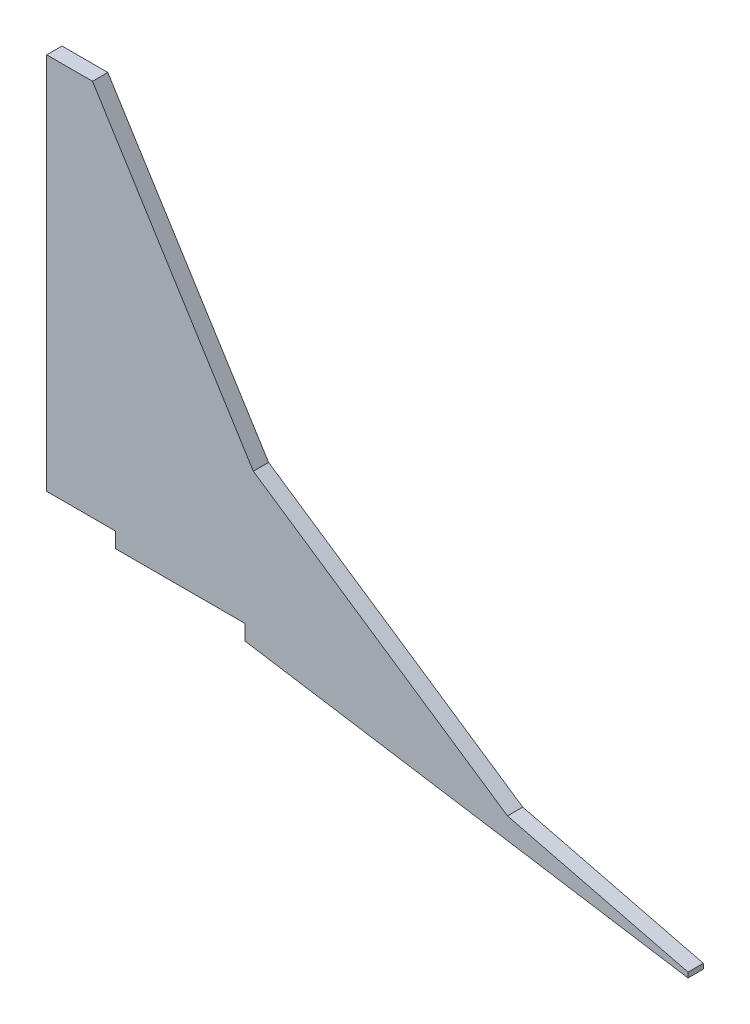
ISO-10303-21;
HEADER;
FILE_DESCRIPTION(('STEP AP214'),'2;1');
FILE_NAME('part.step','',(''),(''),'','','');
FILE_SCHEMA(('AUTOMOTIVE_DESIGN { 1 0 10303 214 1 1 1 1 }'));
ENDSEC;
DATA;
#1=APPLICATION_CONTEXT('core data for automotive mechanical design processes');
#2=APPLICATION_PROTOCOL_DEFINITION('international standard','automotive_design',2000,#1);
#3=PRODUCT_CONTEXT('',#1,'mechanical');
#4=PRODUCT('Part','Part','',(#3));
#5=PRODUCT_RELATED_PRODUCT_CATEGORY('part','',(#4));
#6=PRODUCT_DEFINITION_FORMATION('','',#4);
#7=PRODUCT_DEFINITION_CONTEXT('part definition',#1,'design');
#8=PRODUCT_DEFINITION('design','',#6,#7);
#9=PRODUCT_DEFINITION_SHAPE('','',#8);
#10=(LENGTH_UNIT() NAMED_UNIT(*) SI_UNIT(.MILLI.,.METRE.));
#11=(NAMED_UNIT(*) PLANE_ANGLE_UNIT() SI_UNIT($,.RADIAN.));
#12=(NAMED_UNIT(*) SI_UNIT($,.STERADIAN.) SOLID_ANGLE_UNIT());
#13=UNCERTAINTY_MEASURE_WITH_UNIT(LENGTH_MEASURE(1.E-05),#10,'distance_accuracy_value','');
#14=(GEOMETRIC_REPRESENTATION_CONTEXT(3) GLOBAL_UNCERTAINTY_ASSIGNED_CONTEXT((#13)) GLOBAL_UNIT_ASSIGNED_CONTEXT((#10,
#11,#12)) REPRESENTATION_CONTEXT('',''));
#15=CARTESIAN_POINT('',(0.,0.,0.));
#16=DIRECTION('',(0.,0.,1.));
#17=DIRECTION('',(1.,0.,0.));
#18=AXIS2_PLACEMENT_3D('',#15,#16,#17);
#19=CARTESIAN_POINT('',(94.5,9.,1.));
#20=DIRECTION('',(1.,0.,0.));
#21=DIRECTION('',(0.,0.,-1.));
#22=AXIS2_PLACEMENT_3D('',#19,#20,#21);
#23=PLANE('',#22);
#24=DIRECTION('',(0.,-1.,0.));
#25=VECTOR('',#24,1.);
#26=CARTESIAN_POINT('',(94.5,9.,0.));
#27=LINE('',#26,#25);
#28=CARTESIAN_POINT('',(94.5,9.,0.));
#29=VERTEX_POINT('',#28);
#30=CARTESIAN_POINT('',(94.5,8.,0.));
#31=VERTEX_POINT('',#30);
#32=EDGE_CURVE('E166',#29,#31,#27,.T.);
#33=ORIENTED_EDGE('',*,*,#32,.T.);
#34=DIRECTION('',(0.,0.,-1.));
#35=VECTOR('',#34,1.);
#36=CARTESIAN_POINT('',(94.5,8.,1.));
#37=LINE('',#36,#35);
#38=CARTESIAN_POINT('',(94.5,8.,1.));
#39=VERTEX_POINT('',#38);
#40=EDGE_CURVE('E11',#39,#31,#37,.T.);
#41=ORIENTED_EDGE('',*,*,#40,.F.);
#42=DIRECTION('',(0.,-1.,0.));
#43=VECTOR('',#42,1.);
#44=CARTESIAN_POINT('',(94.5,9.,1.));
#45=LINE('',#44,#43);
#46=CARTESIAN_POINT('',(94.5,9.,1.));
#47=VERTEX_POINT('',#46);
#48=EDGE_CURVE('E196',#47,#39,#45,.T.);
#49=ORIENTED_EDGE('',*,*,#48,.F.);
#50=DIRECTION('',(0.,0.,-1.));
#51=VECTOR('',#50,1.);
#52=CARTESIAN_POINT('',(94.5,9.,1.));
#53=LINE('',#52,#51);
#54=EDGE_CURVE('E162',#47,#29,#53,.T.);
#55=ORIENTED_EDGE('',*,*,#54,.T.);
#56=EDGE_LOOP('',(#33,#41,#49,#55));
#57=FACE_BOUND('',#56,.T.);
#58=ADVANCED_FACE('F45',(#57),#23,.F.);
#59=CARTESIAN_POINT('',(94.5,8.,1.));
#60=DIRECTION('',(0.,1.,0.));
#61=DIRECTION('',(0.,0.,1.));
#62=AXIS2_PLACEMENT_3D('',#59,#60,#61);
#63=PLANE('',#62);
#64=DIRECTION('',(1.,0.,0.));
#65=VECTOR('',#64,1.);
#66=CARTESIAN_POINT('',(94.5,8.,0.));
#67=LINE('',#66,#65);
#68=CARTESIAN_POINT('',(103.,8.,0.));
#69=VERTEX_POINT('',#68);
#70=EDGE_CURVE('E170',#31,#69,#67,.T.);
#71=ORIENTED_EDGE('',*,*,#70,.T.);
#72=DIRECTION('',(0.,0.,-1.));
#73=VECTOR('',#72,1.);
#74=CARTESIAN_POINT('',(103.,8.,1.));
#75=LINE('',#74,#73);
#76=CARTESIAN_POINT('',(103.,8.,1.));
#77=VERTEX_POINT('',#76);
#78=EDGE_CURVE('E54',#77,#69,#75,.T.);
#79=ORIENTED_EDGE('',*,*,#78,.F.);
#80=DIRECTION('',(1.,0.,0.));
#81=VECTOR('',#80,1.);
#82=CARTESIAN_POINT('',(94.5,8.,1.));
#83=LINE('',#82,#81);
#84=EDGE_CURVE('E114',#39,#77,#83,.T.);
#85=ORIENTED_EDGE('',*,*,#84,.F.);
#86=ORIENTED_EDGE('',*,*,#40,.T.);
#87=EDGE_LOOP('',(#71,#79,#85,#86));
#88=FACE_BOUND('',#87,.T.);
#89=ADVANCED_FACE('F266',(#88),#63,.F.);
#90=CARTESIAN_POINT('',(103.,8.,1.));
#91=DIRECTION('',(1.,0.,0.));
#92=DIRECTION('',(0.,0.,-1.));
#93=AXIS2_PLACEMENT_3D('',#90,#91,#92);
#94=PLANE('',#93);
#95=DIRECTION('',(0.,-1.,0.));
#96=VECTOR('',#95,1.);
#97=CARTESIAN_POINT('',(103.,8.,0.));
#98=LINE('',#97,#96);
#99=CARTESIAN_POINT('',(103.,7.,0.));
#100=VERTEX_POINT('',#99);
#101=EDGE_CURVE('E173',#69,#100,#98,.T.);
#102=ORIENTED_EDGE('',*,*,#101,.T.);
#103=DIRECTION('',(0.,0.,-1.));
#104=VECTOR('',#103,1.);
#105=CARTESIAN_POINT('',(103.,7.,1.));
#106=LINE('',#105,#104);
#107=CARTESIAN_POINT('',(103.,7.,1.));
#108=VERTEX_POINT('',#107);
#109=EDGE_CURVE('E218',#108,#100,#106,.T.);
#110=ORIENTED_EDGE('',*,*,#109,.F.);
#111=DIRECTION('',(0.,-1.,0.));
#112=VECTOR('',#111,1.);
#113=CARTESIAN_POINT('',(103.,8.,1.));
#114=LINE('',#113,#112);
#115=EDGE_CURVE('E229',#77,#108,#114,.T.);
#116=ORIENTED_EDGE('',*,*,#115,.F.);
#117=ORIENTED_EDGE('',*,*,#78,.T.);
#118=EDGE_LOOP('',(#102,#110,#116,#117));
#119=FACE_BOUND('',#118,.T.);
#120=ADVANCED_FACE('F227',(#119),#94,.F.);
#121=CARTESIAN_POINT('',(103.,7.,1.));
#122=DIRECTION('',(0.156662083026902,0.987652262560904,0.));
#123=DIRECTION('',(-0.987652262560904,0.156662083026902,0.));
#124=AXIS2_PLACEMENT_3D('',#121,#122,#123);
#125=PLANE('',#124);
#126=DIRECTION('',(0.987652262560904,-0.156662083026902,0.));
#127=VECTOR('',#126,1.);
#128=CARTESIAN_POINT('',(103.,7.,0.));
#129=LINE('',#128,#127);
#130=CARTESIAN_POINT('',(132.,2.4,0.));
#131=VERTEX_POINT('',#130);
#132=EDGE_CURVE('E176',#100,#131,#129,.T.);
#133=ORIENTED_EDGE('',*,*,#132,.T.);
#134=DIRECTION('',(0.,0.,-1.));
#135=VECTOR('',#134,1.);
#136=CARTESIAN_POINT('',(132.,2.4,1.));
#137=LINE('',#136,#135);
#138=CARTESIAN_POINT('',(132.,2.4,1.));
#139=VERTEX_POINT('',#138);
#140=EDGE_CURVE('E214',#139,#131,#137,.T.);
#141=ORIENTED_EDGE('',*,*,#140,.F.);
#142=DIRECTION('',(0.987652262560904,-0.156662083026902,0.));
#143=VECTOR('',#142,1.);
#144=CARTESIAN_POINT('',(103.,7.,1.));
#145=LINE('',#144,#143);
#146=EDGE_CURVE('E248',#108,#139,#145,.T.);
#147=ORIENTED_EDGE('',*,*,#146,.F.);
#148=ORIENTED_EDGE('',*,*,#109,.T.);
#149=EDGE_LOOP('',(#133,#141,#147,#148));
#150=FACE_BOUND('',#149,.T.);
#151=ADVANCED_FACE('F238',(#150),#125,.F.);
#152=CARTESIAN_POINT('',(132.,2.4,1.));
#153=DIRECTION('',(-1.,0.,0.));
#154=DIRECTION('',(0.,0.,1.));
#155=AXIS2_PLACEMENT_3D('',#152,#153,#154);
#156=PLANE('',#155);
#157=DIRECTION('',(0.,1.,0.));
#158=VECTOR('',#157,1.);
#159=CARTESIAN_POINT('',(132.,2.4,0.));
#160=LINE('',#159,#158);
#161=CARTESIAN_POINT('',(132.,2.733396764,0.));
#162=VERTEX_POINT('',#161);
#163=EDGE_CURVE('E179',#131,#162,#160,.T.);
#164=ORIENTED_EDGE('',*,*,#163,.T.);
#165=DIRECTION('',(0.,0.,-1.));
#166=VECTOR('',#165,1.);
#167=CARTESIAN_POINT('',(132.,2.733396764,1.));
#168=LINE('',#167,#166);
#169=CARTESIAN_POINT('',(132.,2.733396764,1.));
#170=VERTEX_POINT('',#169);
#171=EDGE_CURVE('E211',#170,#162,#168,.T.);
#172=ORIENTED_EDGE('',*,*,#171,.F.);
#173=DIRECTION('',(0.,1.,0.));
#174=VECTOR('',#173,1.);
#175=CARTESIAN_POINT('',(132.,2.4,1.));
#176=LINE('',#175,#174);
#177=EDGE_CURVE('E244',#139,#170,#176,.T.);
#178=ORIENTED_EDGE('',*,*,#177,.F.);
#179=ORIENTED_EDGE('',*,*,#140,.T.);
#180=EDGE_LOOP('',(#164,#172,#178,#179));
#181=FACE_BOUND('',#180,.T.);
#182=ADVANCED_FACE('F242',(#181),#156,.F.);
#183=CARTESIAN_POINT('',(132.,2.733396764,1.));
#184=DIRECTION('',(-0.241921895576087,-0.970295726281876,0.));
#185=DIRECTION('',(0.970295726281876,-0.241921895576087,0.));
#186=AXIS2_PLACEMENT_3D('',#183,#184,#185);
#187=PLANE('',#186);
#188=DIRECTION('',(-0.970295726281876,0.241921895576088,0.));
#189=VECTOR('',#188,1.);
#190=CARTESIAN_POINT('',(132.,2.733396764,0.));
#191=LINE('',#190,#189);
#192=CARTESIAN_POINT('',(120.173977577,5.681955316,0.));
#193=VERTEX_POINT('',#192);
#194=EDGE_CURVE('E181',#162,#193,#191,.T.);
#195=ORIENTED_EDGE('',*,*,#194,.T.);
#196=DIRECTION('',(0.,0.,-1.));
#197=VECTOR('',#196,1.);
#198=CARTESIAN_POINT('',(120.173977577,5.681955316,1.));
#199=LINE('',#198,#197);
#200=CARTESIAN_POINT('',(120.173977577,5.681955316,1.));
#201=VERTEX_POINT('',#200);
#202=EDGE_CURVE('E207',#201,#193,#199,.T.);
#203=ORIENTED_EDGE('',*,*,#202,.F.);
#204=DIRECTION('',(-0.970295726281876,0.241921895576088,0.));
#205=VECTOR('',#204,1.);
#206=CARTESIAN_POINT('',(132.,2.733396764,1.));
#207=LINE('',#206,#205);
#208=EDGE_CURVE('E247',#170,#201,#207,.T.);
#209=ORIENTED_EDGE('',*,*,#208,.F.);
#210=ORIENTED_EDGE('',*,*,#171,.T.);
#211=EDGE_LOOP('',(#195,#203,#209,#210));
#212=FACE_BOUND('',#211,.T.);
#213=ADVANCED_FACE('F277',(#212),#187,.F.);
#214=CARTESIAN_POINT('',(120.173977577,5.681955316,1.));
#215=DIRECTION('',(-0.559192903475712,-0.829037572551693,0.));
#216=DIRECTION('',(0.829037572551693,-0.559192903475712,0.));
#217=AXIS2_PLACEMENT_3D('',#214,#215,#216);
#218=PLANE('',#217);
#219=DIRECTION('',(-0.829037572551693,0.559192903475712,0.));
#220=VECTOR('',#219,1.);
#221=CARTESIAN_POINT('',(120.173977577,5.681955316,0.));
#222=LINE('',#221,#220);
#223=CARTESIAN_POINT('',(103.529179441,16.90901342,0.));
#224=VERTEX_POINT('',#223);
#225=EDGE_CURVE('E184',#193,#224,#222,.T.);
#226=ORIENTED_EDGE('',*,*,#225,.T.);
#227=DIRECTION('',(0.,0.,-1.));
#228=VECTOR('',#227,1.);
#229=CARTESIAN_POINT('',(103.529179441,16.90901342,1.));
#230=LINE('',#229,#228);
#231=CARTESIAN_POINT('',(103.529179441,16.90901342,1.));
#232=VERTEX_POINT('',#231);
#233=EDGE_CURVE('E203',#232,#224,#230,.T.);
#234=ORIENTED_EDGE('',*,*,#233,.F.);
#235=DIRECTION('',(-0.829037572551693,0.559192903475712,0.));
#236=VECTOR('',#235,1.);
#237=CARTESIAN_POINT('',(120.173977577,5.681955316,1.));
#238=LINE('',#237,#236);
#239=EDGE_CURVE('E250',#201,#232,#238,.T.);
#240=ORIENTED_EDGE('',*,*,#239,.F.);
#241=ORIENTED_EDGE('',*,*,#202,.T.);
#242=EDGE_LOOP('',(#226,#234,#240,#241));
#243=FACE_BOUND('',#242,.T.);
#244=ADVANCED_FACE('F280',(#243),#218,.F.);
#245=CARTESIAN_POINT('',(103.529179441,16.90901342,1.));
#246=DIRECTION('',(-0.848048096157819,-0.529919264230976,0.));
#247=DIRECTION('',(0.529919264230976,-0.848048096157819,0.));
#248=AXIS2_PLACEMENT_3D('',#245,#246,#247);
#249=PLANE('',#248);
#250=DIRECTION('',(-0.529919264230976,0.848048096157819,0.));
#251=VECTOR('',#250,1.);
#252=CARTESIAN_POINT('',(103.529179441,16.90901342,0.));
#253=LINE('',#252,#251);
#254=CARTESIAN_POINT('',(93.,33.759222842,0.));
#255=VERTEX_POINT('',#254);
#256=EDGE_CURVE('E187',#224,#255,#253,.T.);
#257=ORIENTED_EDGE('',*,*,#256,.T.);
#258=DIRECTION('',(0.,0.,-1.));
#259=VECTOR('',#258,1.);
#260=CARTESIAN_POINT('',(93.,33.759222842,1.));
#261=LINE('',#260,#259);
#262=CARTESIAN_POINT('',(93.,33.759222842,1.));
#263=VERTEX_POINT('',#262);
#264=EDGE_CURVE('E153',#263,#255,#261,.T.);
#265=ORIENTED_EDGE('',*,*,#264,.F.);
#266=DIRECTION('',(-0.529919264230976,0.848048096157819,0.));
#267=VECTOR('',#266,1.);
#268=CARTESIAN_POINT('',(103.529179441,16.90901342,1.));
#269=LINE('',#268,#267);
#270=EDGE_CURVE('E142',#232,#263,#269,.T.);
#271=ORIENTED_EDGE('',*,*,#270,.F.);
#272=ORIENTED_EDGE('',*,*,#233,.T.);
#273=EDGE_LOOP('',(#257,#265,#271,#272));
#274=FACE_BOUND('',#273,.T.);
#275=ADVANCED_FACE('F284',(#274),#249,.F.);
#276=CARTESIAN_POINT('',(93.,33.759222842,1.));
#277=DIRECTION('',(0.,-1.,0.));
#278=DIRECTION('',(0.,0.,-1.));
#279=AXIS2_PLACEMENT_3D('',#276,#277,#278);
#280=PLANE('',#279);
#281=DIRECTION('',(-1.,0.,0.));
#282=VECTOR('',#281,1.);
#283=CARTESIAN_POINT('',(93.,33.759222842,0.));
#284=LINE('',#283,#282);
#285=CARTESIAN_POINT('',(90.,33.759222842,0.));
#286=VERTEX_POINT('',#285);
#287=EDGE_CURVE('E151',#255,#286,#284,.T.);
#288=ORIENTED_EDGE('',*,*,#287,.T.);
#289=DIRECTION('',(0.,0.,-1.));
#290=VECTOR('',#289,1.);
#291=CARTESIAN_POINT('',(90.,33.759222842,1.));
#292=LINE('',#291,#290);
#293=CARTESIAN_POINT('',(90.,33.759222842,1.));
#294=VERTEX_POINT('',#293);
#295=EDGE_CURVE('E148',#294,#286,#292,.T.);
#296=ORIENTED_EDGE('',*,*,#295,.F.);
#297=DIRECTION('',(-1.,0.,0.));
#298=VECTOR('',#297,1.);
#299=CARTESIAN_POINT('',(93.,33.759222842,1.));
#300=LINE('',#299,#298);
#301=EDGE_CURVE('E136',#263,#294,#300,.T.);
#302=ORIENTED_EDGE('',*,*,#301,.F.);
#303=ORIENTED_EDGE('',*,*,#264,.T.);
#304=EDGE_LOOP('',(#288,#296,#302,#303));
#305=FACE_BOUND('',#304,.T.);
#306=ADVANCED_FACE('F149',(#305),#280,.F.);
#307=CARTESIAN_POINT('',(90.,33.759222842,1.));
#308=DIRECTION('',(1.,0.,0.));
#309=DIRECTION('',(0.,0.,-1.));
#310=AXIS2_PLACEMENT_3D('',#307,#308,#309);
#311=PLANE('',#310);
#312=DIRECTION('',(0.,-1.,0.));
#313=VECTOR('',#312,1.);
#314=CARTESIAN_POINT('',(90.,33.759222842,0.));
#315=LINE('',#314,#313);
#316=CARTESIAN_POINT('',(90.,9.,0.));
#317=VERTEX_POINT('',#316);
#318=EDGE_CURVE('E100',#286,#317,#315,.T.);
#319=ORIENTED_EDGE('',*,*,#318,.T.);
#320=DIRECTION('',(0.,0.,-1.));
#321=VECTOR('',#320,1.);
#322=CARTESIAN_POINT('',(90.,9.,1.));
#323=LINE('',#322,#321);
#324=CARTESIAN_POINT('',(90.,9.,1.));
#325=VERTEX_POINT('',#324);
#326=EDGE_CURVE('E154',#325,#317,#323,.T.);
#327=ORIENTED_EDGE('',*,*,#326,.F.);
#328=DIRECTION('',(0.,-1.,0.));
#329=VECTOR('',#328,1.);
#330=CARTESIAN_POINT('',(90.,33.759222842,1.));
#331=LINE('',#330,#329);
#332=EDGE_CURVE('E140',#294,#325,#331,.T.);
#333=ORIENTED_EDGE('',*,*,#332,.F.);
#334=ORIENTED_EDGE('',*,*,#295,.T.);
#335=EDGE_LOOP('',(#319,#327,#333,#334));
#336=FACE_BOUND('',#335,.T.);
#337=ADVANCED_FACE('F156',(#336),#311,.F.);
#338=CARTESIAN_POINT('',(90.,9.,1.));
#339=DIRECTION('',(0.,1.,0.));
#340=DIRECTION('',(0.,0.,1.));
#341=AXIS2_PLACEMENT_3D('',#338,#339,#340);
#342=PLANE('',#341);
#343=DIRECTION('',(1.,0.,0.));
#344=VECTOR('',#343,1.);
#345=CARTESIAN_POINT('',(90.,9.,0.));
#346=LINE('',#345,#344);
#347=EDGE_CURVE('E106',#317,#29,#346,.T.);
#348=ORIENTED_EDGE('',*,*,#347,.T.);
#349=ORIENTED_EDGE('',*,*,#54,.F.);
#350=DIRECTION('',(1.,0.,0.));
#351=VECTOR('',#350,1.);
#352=CARTESIAN_POINT('',(90.,9.,1.));
#353=LINE('',#352,#351);
#354=EDGE_CURVE('E62',#325,#47,#353,.T.);
#355=ORIENTED_EDGE('',*,*,#354,.F.);
#356=ORIENTED_EDGE('',*,*,#326,.T.);
#357=EDGE_LOOP('',(#348,#349,#355,#356));
#358=FACE_BOUND('',#357,.T.);
#359=ADVANCED_FACE('F293',(#358),#342,.F.);
#360=CARTESIAN_POINT('',(0.,0.,1.));
#361=DIRECTION('',(0.,0.,1.));
#362=DIRECTION('',(1.,0.,0.));
#363=AXIS2_PLACEMENT_3D('',#360,#361,#362);
#364=PLANE('',#363);
#365=ORIENTED_EDGE('',*,*,#48,.T.);
#366=ORIENTED_EDGE('',*,*,#84,.T.);
#367=ORIENTED_EDGE('',*,*,#115,.T.);
#368=ORIENTED_EDGE('',*,*,#146,.T.);
#369=ORIENTED_EDGE('',*,*,#177,.T.);
#370=ORIENTED_EDGE('',*,*,#208,.T.);
#371=ORIENTED_EDGE('',*,*,#239,.T.);
#372=ORIENTED_EDGE('',*,*,#270,.T.);
#373=ORIENTED_EDGE('',*,*,#301,.T.);
#374=ORIENTED_EDGE('',*,*,#332,.T.);
#375=ORIENTED_EDGE('',*,*,#354,.T.);
#376=EDGE_LOOP('',(#365,#366,#367,#368,#369,#370,#371,#372,#373,#374,#375));
#377=FACE_BOUND('',#376,.T.);
#378=ADVANCED_FACE('F138',(#377),#364,.T.);
#379=CARTESIAN_POINT('',(0.,0.,0.));
#380=DIRECTION('',(0.,0.,1.));
#381=DIRECTION('',(1.,0.,0.));
#382=AXIS2_PLACEMENT_3D('',#379,#380,#381);
#383=PLANE('',#382);
#384=ORIENTED_EDGE('',*,*,#32,.F.);
#385=ORIENTED_EDGE('',*,*,#347,.F.);
#386=ORIENTED_EDGE('',*,*,#318,.F.);
#387=ORIENTED_EDGE('',*,*,#287,.F.);
#388=ORIENTED_EDGE('',*,*,#256,.F.);
#389=ORIENTED_EDGE('',*,*,#225,.F.);
#390=ORIENTED_EDGE('',*,*,#194,.F.);
#391=ORIENTED_EDGE('',*,*,#163,.F.);
#392=ORIENTED_EDGE('',*,*,#132,.F.);
#393=ORIENTED_EDGE('',*,*,#101,.F.);
#394=ORIENTED_EDGE('',*,*,#70,.F.);
#395=EDGE_LOOP('',(#384,#385,#386,#387,#388,#389,#390,#391,#392,#393,#394));
#396=FACE_BOUND('',#395,.T.);
#397=ADVANCED_FACE('F233',(#396),#383,.F.);
#398=CLOSED_SHELL('',(#58,#89,#120,#151,#182,#213,#244,#275,#306,#337,#359,#378,#397));
#399=MANIFOLD_SOLID_BREP('B2',#398);
#400=ADVANCED_BREP_SHAPE_REPRESENTATION('',(#18,#399),#14);
#401=SHAPE_DEFINITION_REPRESENTATION(#9,#400);
ENDSEC;
END-ISO-10303-21;
